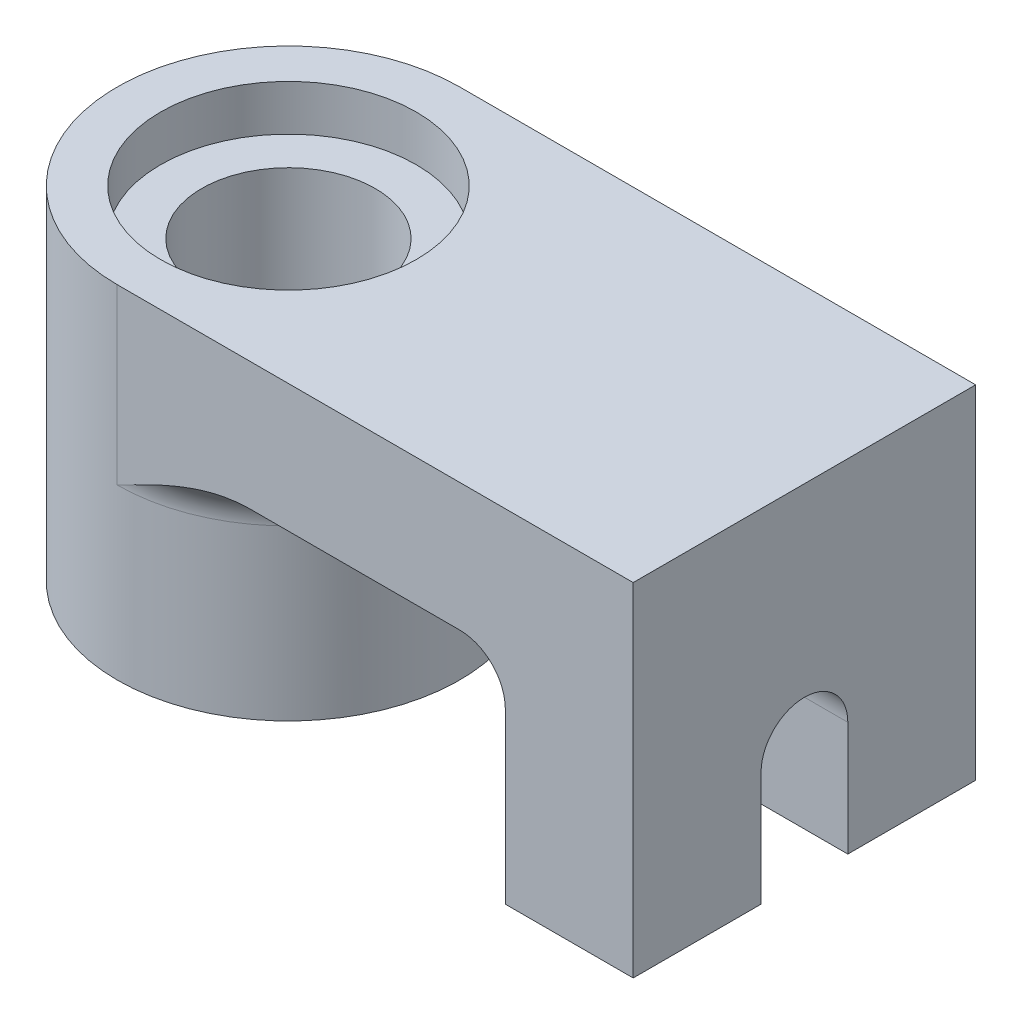
ISO-10303-21;
HEADER;
FILE_DESCRIPTION(('STEP AP214'),'2;1');
FILE_NAME('part.step','',(''),(''),'','','');
FILE_SCHEMA(('AUTOMOTIVE_DESIGN { 1 0 10303 214 1 1 1 1 }'));
ENDSEC;
DATA;
#1=APPLICATION_CONTEXT('core data for automotive mechanical design processes');
#2=APPLICATION_PROTOCOL_DEFINITION('international standard','automotive_design',2000,#1);
#3=PRODUCT_CONTEXT('',#1,'mechanical');
#4=PRODUCT('Part','Part','',(#3));
#5=PRODUCT_RELATED_PRODUCT_CATEGORY('part','',(#4));
#6=PRODUCT_DEFINITION_FORMATION('','',#4);
#7=PRODUCT_DEFINITION_CONTEXT('part definition',#1,'design');
#8=PRODUCT_DEFINITION('design','',#6,#7);
#9=PRODUCT_DEFINITION_SHAPE('','',#8);
#10=(LENGTH_UNIT() NAMED_UNIT(*) SI_UNIT(.MILLI.,.METRE.));
#11=(NAMED_UNIT(*) PLANE_ANGLE_UNIT() SI_UNIT($,.RADIAN.));
#12=(NAMED_UNIT(*) SI_UNIT($,.STERADIAN.) SOLID_ANGLE_UNIT());
#13=UNCERTAINTY_MEASURE_WITH_UNIT(LENGTH_MEASURE(1.E-05),#10,'distance_accuracy_value','');
#14=(GEOMETRIC_REPRESENTATION_CONTEXT(3) GLOBAL_UNCERTAINTY_ASSIGNED_CONTEXT((#13)) GLOBAL_UNIT_ASSIGNED_CONTEXT((#10,
#11,#12)) REPRESENTATION_CONTEXT('',''));
#15=CARTESIAN_POINT('',(0.,0.,0.));
#16=DIRECTION('',(0.,0.,1.));
#17=DIRECTION('',(1.,0.,0.));
#18=AXIS2_PLACEMENT_3D('',#15,#16,#17);
#19=CARTESIAN_POINT('',(0.,65.,0.));
#20=DIRECTION('',(0.,1.,0.));
#21=DIRECTION('',(0.,0.,1.));
#22=AXIS2_PLACEMENT_3D('',#19,#20,#21);
#23=PLANE('',#22);
#24=CARTESIAN_POINT('',(0.,65.,0.));
#25=DIRECTION('',(0.,1.,0.));
#26=DIRECTION('',(0.,0.,1.));
#27=AXIS2_PLACEMENT_3D('',#24,#25,#26);
#28=CIRCLE('',#27,28.);
#29=CARTESIAN_POINT('',(0.,65.,28.));
#30=VERTEX_POINT('',#29);
#31=EDGE_CURVE('E185',#30,#30,#28,.T.);
#32=ORIENTED_EDGE('',*,*,#31,.T.);
#33=EDGE_LOOP('',(#32));
#34=FACE_BOUND('',#33,.T.);
#35=DIRECTION('',(1.,0.,0.));
#36=VECTOR('',#35,1.);
#37=CARTESIAN_POINT('',(18.3303027798234,65.,-5.));
#38=LINE('',#37,#36);
#39=CARTESIAN_POINT('',(18.3303027798234,65.,-5.));
#40=VERTEX_POINT('',#39);
#41=CARTESIAN_POINT('',(22.,65.,-5.));
#42=VERTEX_POINT('',#41);
#43=EDGE_CURVE('E160',#40,#42,#38,.T.);
#44=ORIENTED_EDGE('',*,*,#43,.T.);
#45=DIRECTION('',(0.,0.,1.));
#46=VECTOR('',#45,1.);
#47=CARTESIAN_POINT('',(22.,65.,5.));
#48=LINE('',#47,#46);
#49=CARTESIAN_POINT('',(22.,65.,5.));
#50=VERTEX_POINT('',#49);
#51=EDGE_CURVE('E152',#42,#50,#48,.T.);
#52=ORIENTED_EDGE('',*,*,#51,.T.);
#53=DIRECTION('',(-1.,0.,0.));
#54=VECTOR('',#53,1.);
#55=CARTESIAN_POINT('',(18.3303027798234,65.,5.));
#56=LINE('',#55,#54);
#57=CARTESIAN_POINT('',(18.3303027798234,65.,5.));
#58=VERTEX_POINT('',#57);
#59=EDGE_CURVE('E163',#50,#58,#56,.T.);
#60=ORIENTED_EDGE('',*,*,#59,.T.);
#61=CARTESIAN_POINT('',(0.,65.,0.));
#62=DIRECTION('',(0.,-1.,0.));
#63=DIRECTION('',(0.,0.,-1.));
#64=AXIS2_PLACEMENT_3D('',#61,#62,#63);
#65=CIRCLE('',#64,19.);
#66=EDGE_CURVE('E57',#58,#40,#65,.T.);
#67=ORIENTED_EDGE('',*,*,#66,.T.);
#68=EDGE_LOOP('',(#44,#52,#60,#67));
#69=FACE_BOUND('',#68,.T.);
#70=ADVANCED_FACE('F37',(#34,#69),#23,.T.);
#71=CARTESIAN_POINT('',(85.,0.,0.));
#72=DIRECTION('',(0.,-1.,0.));
#73=DIRECTION('',(0.,0.,-1.));
#74=AXIS2_PLACEMENT_3D('',#71,#72,#73);
#75=PLANE('',#74);
#76=DIRECTION('',(1.,0.,0.));
#77=VECTOR('',#76,1.);
#78=CARTESIAN_POINT('',(85.,0.,9.5));
#79=LINE('',#78,#77);
#80=CARTESIAN_POINT('',(85.,0.,9.5));
#81=VERTEX_POINT('',#80);
#82=CARTESIAN_POINT('',(113.,0.,9.5));
#83=VERTEX_POINT('',#82);
#84=EDGE_CURVE('E207',#81,#83,#79,.T.);
#85=ORIENTED_EDGE('',*,*,#84,.T.);
#86=DIRECTION('',(0.,0.,-1.));
#87=VECTOR('',#86,1.);
#88=CARTESIAN_POINT('',(113.,0.,0.));
#89=LINE('',#88,#87);
#90=CARTESIAN_POINT('',(113.,0.,37.5));
#91=VERTEX_POINT('',#90);
#92=EDGE_CURVE('E226',#91,#83,#89,.T.);
#93=ORIENTED_EDGE('',*,*,#92,.F.);
#94=DIRECTION('',(1.,0.,0.));
#95=VECTOR('',#94,1.);
#96=CARTESIAN_POINT('',(85.,0.,37.5));
#97=LINE('',#96,#95);
#98=CARTESIAN_POINT('',(85.,0.,37.5));
#99=VERTEX_POINT('',#98);
#100=EDGE_CURVE('E232',#99,#91,#97,.T.);
#101=ORIENTED_EDGE('',*,*,#100,.F.);
#102=DIRECTION('',(0.,0.,-1.));
#103=VECTOR('',#102,1.);
#104=CARTESIAN_POINT('',(85.,0.,0.));
#105=LINE('',#104,#103);
#106=EDGE_CURVE('E229',#99,#81,#105,.T.);
#107=ORIENTED_EDGE('',*,*,#106,.T.);
#108=EDGE_LOOP('',(#85,#93,#101,#107));
#109=FACE_BOUND('',#108,.T.);
#110=ADVANCED_FACE('F321',(#109),#75,.T.);
#111=CARTESIAN_POINT('',(0.,47.,0.));
#112=DIRECTION('',(0.,1.,0.));
#113=DIRECTION('',(0.,0.,1.));
#114=AXIS2_PLACEMENT_3D('',#111,#112,#113);
#115=PLANE('',#114);
#116=DIRECTION('',(1.,0.,0.));
#117=VECTOR('',#116,1.);
#118=CARTESIAN_POINT('',(113.,47.,37.5));
#119=LINE('',#118,#117);
#120=CARTESIAN_POINT('',(29.1547594742265,47.,37.5));
#121=VERTEX_POINT('',#120);
#122=CARTESIAN_POINT('',(75.,47.,37.5));
#123=VERTEX_POINT('',#122);
#124=EDGE_CURVE('E241',#121,#123,#119,.T.);
#125=ORIENTED_EDGE('',*,*,#124,.F.);
#126=CARTESIAN_POINT('',(0.,47.,0.));
#127=DIRECTION('',(0.,1.,0.));
#128=DIRECTION('',(0.,0.,1.));
#129=AXIS2_PLACEMENT_3D('',#126,#127,#128);
#130=CIRCLE('',#129,47.5);
#131=CARTESIAN_POINT('',(29.1547594742265,47.,-37.5));
#132=VERTEX_POINT('',#131);
#133=EDGE_CURVE('E275',#121,#132,#130,.T.);
#134=ORIENTED_EDGE('',*,*,#133,.T.);
#135=DIRECTION('',(-1.,0.,0.));
#136=VECTOR('',#135,1.);
#137=CARTESIAN_POINT('',(0.,47.,-37.5));
#138=LINE('',#137,#136);
#139=CARTESIAN_POINT('',(75.,47.,-37.5));
#140=VERTEX_POINT('',#139);
#141=EDGE_CURVE('E244',#140,#132,#138,.T.);
#142=ORIENTED_EDGE('',*,*,#141,.F.);
#143=DIRECTION('',(0.,0.,-1.));
#144=VECTOR('',#143,1.);
#145=CARTESIAN_POINT('',(75.,47.,37.5));
#146=LINE('',#145,#144);
#147=EDGE_CURVE('E273',#140,#123,#146,.F.);
#148=ORIENTED_EDGE('',*,*,#147,.T.);
#149=EDGE_LOOP('',(#125,#134,#142,#148));
#150=FACE_BOUND('',#149,.T.);
#151=ADVANCED_FACE('F308',(#150),#115,.F.);
#152=CARTESIAN_POINT('',(0.,75.,0.));
#153=DIRECTION('',(0.,-1.,0.));
#154=DIRECTION('',(0.,0.,-1.));
#155=AXIS2_PLACEMENT_3D('',#152,#153,#154);
#156=CYLINDRICAL_SURFACE('',#155,37.5);
#157=CARTESIAN_POINT('',(0.,37.,0.));
#158=DIRECTION('',(0.,1.,0.));
#159=DIRECTION('',(0.,0.,1.));
#160=AXIS2_PLACEMENT_3D('',#157,#158,#159);
#161=CIRCLE('',#160,37.5);
#162=CARTESIAN_POINT('',(0.,37.,-37.5));
#163=VERTEX_POINT('',#162);
#164=CARTESIAN_POINT('',(0.,37.,37.5));
#165=VERTEX_POINT('',#164);
#166=EDGE_CURVE('E268',#163,#165,#161,.F.);
#167=ORIENTED_EDGE('',*,*,#166,.T.);
#168=DIRECTION('',(0.,1.,0.));
#169=VECTOR('',#168,1.);
#170=CARTESIAN_POINT('',(0.,47.,37.5));
#171=LINE('',#170,#169);
#172=CARTESIAN_POINT('',(0.,75.,37.5));
#173=VERTEX_POINT('',#172);
#174=EDGE_CURVE('E248',#165,#173,#171,.T.);
#175=ORIENTED_EDGE('',*,*,#174,.T.);
#176=CARTESIAN_POINT('',(0.,75.,0.));
#177=DIRECTION('',(0.,1.,0.));
#178=DIRECTION('',(0.,0.,1.));
#179=AXIS2_PLACEMENT_3D('',#176,#177,#178);
#180=CIRCLE('',#179,37.5);
#181=CARTESIAN_POINT('',(0.,75.,-37.5));
#182=VERTEX_POINT('',#181);
#183=EDGE_CURVE('E265',#182,#173,#180,.T.);
#184=ORIENTED_EDGE('',*,*,#183,.F.);
#185=DIRECTION('',(0.,1.,0.));
#186=VECTOR('',#185,1.);
#187=CARTESIAN_POINT('',(0.,47.,-37.5));
#188=LINE('',#187,#186);
#189=EDGE_CURVE('E255',#163,#182,#188,.T.);
#190=ORIENTED_EDGE('',*,*,#189,.F.);
#191=EDGE_LOOP('',(#167,#175,#184,#190));
#192=FACE_BOUND('',#191,.T.);
#193=CARTESIAN_POINT('',(0.,0.,0.));
#194=DIRECTION('',(0.,1.,0.));
#195=DIRECTION('',(0.,0.,1.));
#196=AXIS2_PLACEMENT_3D('',#193,#194,#195);
#197=CIRCLE('',#196,37.5);
#198=CARTESIAN_POINT('',(0.,0.,37.5));
#199=VERTEX_POINT('',#198);
#200=EDGE_CURVE('E258',#199,#199,#197,.T.);
#201=ORIENTED_EDGE('',*,*,#200,.T.);
#202=EDGE_LOOP('',(#201));
#203=FACE_BOUND('',#202,.T.);
#204=ADVANCED_FACE('F303',(#192,#203),#156,.T.);
#205=CARTESIAN_POINT('',(0.,75.,0.));
#206=DIRECTION('',(0.,1.,0.));
#207=DIRECTION('',(0.,0.,1.));
#208=AXIS2_PLACEMENT_3D('',#205,#206,#207);
#209=PLANE('',#208);
#210=CARTESIAN_POINT('',(0.,75.,0.));
#211=DIRECTION('',(0.,1.,0.));
#212=DIRECTION('',(0.,0.,1.));
#213=AXIS2_PLACEMENT_3D('',#210,#211,#212);
#214=CIRCLE('',#213,28.);
#215=CARTESIAN_POINT('',(0.,75.,28.));
#216=VERTEX_POINT('',#215);
#217=EDGE_CURVE('E181',#216,#216,#214,.T.);
#218=ORIENTED_EDGE('',*,*,#217,.F.);
#219=EDGE_LOOP('',(#218));
#220=FACE_BOUND('',#219,.T.);
#221=ORIENTED_EDGE('',*,*,#183,.T.);
#222=DIRECTION('',(1.,0.,0.));
#223=VECTOR('',#222,1.);
#224=CARTESIAN_POINT('',(113.,75.,37.5));
#225=LINE('',#224,#223);
#226=CARTESIAN_POINT('',(113.,75.,37.5));
#227=VERTEX_POINT('',#226);
#228=EDGE_CURVE('E238',#173,#227,#225,.T.);
#229=ORIENTED_EDGE('',*,*,#228,.T.);
#230=DIRECTION('',(0.,0.,-1.));
#231=VECTOR('',#230,1.);
#232=CARTESIAN_POINT('',(113.,75.,-37.5));
#233=LINE('',#232,#231);
#234=CARTESIAN_POINT('',(113.,75.,-37.5));
#235=VERTEX_POINT('',#234);
#236=EDGE_CURVE('E251',#227,#235,#233,.T.);
#237=ORIENTED_EDGE('',*,*,#236,.T.);
#238=DIRECTION('',(-1.,0.,0.));
#239=VECTOR('',#238,1.);
#240=CARTESIAN_POINT('',(0.,75.,-37.5));
#241=LINE('',#240,#239);
#242=EDGE_CURVE('E245',#235,#182,#241,.T.);
#243=ORIENTED_EDGE('',*,*,#242,.T.);
#244=EDGE_LOOP('',(#221,#229,#237,#243));
#245=FACE_BOUND('',#244,.T.);
#246=ADVANCED_FACE('F307',(#220,#245),#209,.T.);
#247=CARTESIAN_POINT('',(0.,0.,0.));
#248=DIRECTION('',(0.,1.,0.));
#249=DIRECTION('',(0.,0.,1.));
#250=AXIS2_PLACEMENT_3D('',#247,#248,#249);
#251=PLANE('',#250);
#252=CARTESIAN_POINT('',(0.,0.,0.));
#253=DIRECTION('',(0.,-1.,0.));
#254=DIRECTION('',(0.,0.,-1.));
#255=AXIS2_PLACEMENT_3D('',#252,#253,#254);
#256=CIRCLE('',#255,28.);
#257=CARTESIAN_POINT('',(0.,0.,-28.));
#258=VERTEX_POINT('',#257);
#259=EDGE_CURVE('E188',#258,#258,#256,.T.);
#260=ORIENTED_EDGE('',*,*,#259,.F.);
#261=EDGE_LOOP('',(#260));
#262=FACE_BOUND('',#261,.T.);
#263=ORIENTED_EDGE('',*,*,#200,.F.);
#264=EDGE_LOOP('',(#263));
#265=FACE_BOUND('',#264,.T.);
#266=ADVANCED_FACE('F310',(#262,#265),#251,.F.);
#267=CARTESIAN_POINT('',(0.,47.,-37.5));
#268=DIRECTION('',(0.,0.,-1.));
#269=DIRECTION('',(-1.,0.,0.));
#270=AXIS2_PLACEMENT_3D('',#267,#268,#269);
#271=PLANE('',#270);
#272=ORIENTED_EDGE('',*,*,#242,.F.);
#273=DIRECTION('',(0.,1.,0.));
#274=VECTOR('',#273,1.);
#275=CARTESIAN_POINT('',(113.,47.,-37.5));
#276=LINE('',#275,#274);
#277=CARTESIAN_POINT('',(113.,0.,-37.5));
#278=VERTEX_POINT('',#277);
#279=EDGE_CURVE('E259',#278,#235,#276,.T.);
#280=ORIENTED_EDGE('',*,*,#279,.F.);
#281=DIRECTION('',(1.,0.,0.));
#282=VECTOR('',#281,1.);
#283=CARTESIAN_POINT('',(85.,0.,-37.5));
#284=LINE('',#283,#282);
#285=CARTESIAN_POINT('',(85.,0.,-37.5));
#286=VERTEX_POINT('',#285);
#287=EDGE_CURVE('E235',#286,#278,#284,.T.);
#288=ORIENTED_EDGE('',*,*,#287,.F.);
#289=DIRECTION('',(0.,-1.,0.));
#290=VECTOR('',#289,1.);
#291=CARTESIAN_POINT('',(85.,0.,-37.5));
#292=LINE('',#291,#290);
#293=CARTESIAN_POINT('',(85.,37.,-37.5));
#294=VERTEX_POINT('',#293);
#295=EDGE_CURVE('E223',#294,#286,#292,.T.);
#296=ORIENTED_EDGE('',*,*,#295,.F.);
#297=CARTESIAN_POINT('',(75.,37.,-37.5));
#298=DIRECTION('',(0.,0.,-1.));
#299=DIRECTION('',(-1.,0.,0.));
#300=AXIS2_PLACEMENT_3D('',#297,#298,#299);
#301=CIRCLE('',#300,10.);
#302=EDGE_CURVE('E45',#294,#140,#301,.F.);
#303=ORIENTED_EDGE('',*,*,#302,.T.);
#304=ORIENTED_EDGE('',*,*,#141,.T.);
#305=CARTESIAN_POINT('',(29.1547594742265,47.,-37.5));
#306=CARTESIAN_POINT('',(28.7281693213228,46.9999786648102,-37.5));
#307=CARTESIAN_POINT('',(28.3016560019996,46.9897176285424,-37.5));
#308=CARTESIAN_POINT('',(27.4496484749261,46.9502563822744,-37.5));
#309=CARTESIAN_POINT('',(27.024153956718,46.9210629612355,-37.5));
#310=CARTESIAN_POINT('',(26.1755938350662,46.8453509022313,-37.5));
#311=CARTESIAN_POINT('',(25.7525250727972,46.7988671030009,-37.5));
#312=CARTESIAN_POINT('',(24.9084309647712,46.6899429264348,-37.5));
#313=CARTESIAN_POINT('',(24.4874058253184,46.627500970907,-37.5));
#314=CARTESIAN_POINT('',(23.2383730962655,46.419910698324,-37.5));
#315=CARTESIAN_POINT('',(22.4138500474263,46.2534877898218,-37.5));
#316=CARTESIAN_POINT('',(20.7758132686213,45.8722744341559,-37.5));
#317=CARTESIAN_POINT('',(19.9623061865924,45.6574560495466,-37.5));
#318=CARTESIAN_POINT('',(18.3204624353035,45.1793915225373,-37.5));
#319=CARTESIAN_POINT('',(17.4925271858538,44.9147769090196,-37.5));
#320=CARTESIAN_POINT('',(15.8489631392522,44.349540468796,-37.5));
#321=CARTESIAN_POINT('',(15.0333369587783,44.0489111041277,-37.5));
#322=CARTESIAN_POINT('',(13.4132111825291,43.4180675261109,-37.5));
#323=CARTESIAN_POINT('',(12.6087174048075,43.0878384708328,-37.5));
#324=CARTESIAN_POINT('',(11.0098130339382,42.4037240648882,-37.5));
#325=CARTESIAN_POINT('',(10.2154035091204,42.0498362322809,-37.5));
#326=CARTESIAN_POINT('',(7.83689487856671,40.9571068783275,-37.5));
#327=CARTESIAN_POINT('',(6.26563680593886,40.1904834914459,-37.5));
#328=CARTESIAN_POINT('',(3.14103857075623,38.6218750777498,-37.5));
#329=CARTESIAN_POINT('',(1.58770134812253,37.8198843501225,-37.5));
#330=CARTESIAN_POINT('',(0.0229415743856792,37.0118469772453,-37.5));
#331=CARTESIAN_POINT('',(0.011470787697866,37.0059234884571,-37.5));
#332=CARTESIAN_POINT('',(0.,37.,-37.5));
#333=B_SPLINE_CURVE_WITH_KNOTS('',3,(#305,#306,#307,#308,#309,#310,#311,#312,#313,#314,#315,
#316,#317,#318,#319,#320,#321,#322,#323,#324,#325,#326,#327,#328,#329,#330,#331,#332),
.UNSPECIFIED.,.F.,.F.,(4,2,2,2,2,2,2,2,2,2,2,2,2,4),(0.,1.27953571376794,2.55861285251057,
3.83512659167913,5.11176662137853,7.63330150528421,10.156295752437,12.7628652516213,
15.3699812675309,17.9784119403917,20.587116683209,25.8307743780356,31.0752804024461,
31.1140102359086),.UNSPECIFIED.);
#334=EDGE_CURVE('E287',#132,#163,#333,.T.);
#335=ORIENTED_EDGE('',*,*,#334,.T.);
#336=ORIENTED_EDGE('',*,*,#189,.T.);
#337=EDGE_LOOP('',(#272,#280,#288,#296,#303,#304,#335,#336));
#338=FACE_BOUND('',#337,.T.);
#339=ADVANCED_FACE('F312',(#338),#271,.T.);
#340=CARTESIAN_POINT('',(113.,47.,-37.5));
#341=DIRECTION('',(1.,0.,0.));
#342=DIRECTION('',(0.,0.,-1.));
#343=AXIS2_PLACEMENT_3D('',#340,#341,#342);
#344=PLANE('',#343);
#345=DIRECTION('',(0.,-1.,0.));
#346=VECTOR('',#345,1.);
#347=CARTESIAN_POINT('',(113.,0.,9.5));
#348=LINE('',#347,#346);
#349=CARTESIAN_POINT('',(113.,25.,9.5));
#350=VERTEX_POINT('',#349);
#351=EDGE_CURVE('E194',#350,#83,#348,.T.);
#352=ORIENTED_EDGE('',*,*,#351,.F.);
#353=CARTESIAN_POINT('',(113.,25.,0.));
#354=DIRECTION('',(1.,0.,0.));
#355=DIRECTION('',(0.,0.,1.));
#356=AXIS2_PLACEMENT_3D('',#353,#354,#355);
#357=CIRCLE('',#356,9.5);
#358=CARTESIAN_POINT('',(113.,25.,-9.5));
#359=VERTEX_POINT('',#358);
#360=EDGE_CURVE('E201',#359,#350,#357,.T.);
#361=ORIENTED_EDGE('',*,*,#360,.F.);
#362=DIRECTION('',(0.,1.,0.));
#363=VECTOR('',#362,1.);
#364=CARTESIAN_POINT('',(113.,0.,-9.5));
#365=LINE('',#364,#363);
#366=CARTESIAN_POINT('',(113.,0.,-9.5));
#367=VERTEX_POINT('',#366);
#368=EDGE_CURVE('E209',#367,#359,#365,.T.);
#369=ORIENTED_EDGE('',*,*,#368,.F.);
#370=EDGE_CURVE('E216',#367,#278,#89,.T.);
#371=ORIENTED_EDGE('',*,*,#370,.T.);
#372=ORIENTED_EDGE('',*,*,#279,.T.);
#373=ORIENTED_EDGE('',*,*,#236,.F.);
#374=DIRECTION('',(0.,1.,0.));
#375=VECTOR('',#374,1.);
#376=CARTESIAN_POINT('',(113.,47.,37.5));
#377=LINE('',#376,#375);
#378=EDGE_CURVE('E261',#91,#227,#377,.T.);
#379=ORIENTED_EDGE('',*,*,#378,.F.);
#380=ORIENTED_EDGE('',*,*,#92,.T.);
#381=EDGE_LOOP('',(#352,#361,#369,#371,#372,#373,#379,#380));
#382=FACE_BOUND('',#381,.T.);
#383=ADVANCED_FACE('F366',(#382),#344,.T.);
#384=CARTESIAN_POINT('',(113.,47.,37.5));
#385=DIRECTION('',(0.,0.,1.));
#386=DIRECTION('',(1.,0.,0.));
#387=AXIS2_PLACEMENT_3D('',#384,#385,#386);
#388=PLANE('',#387);
#389=ORIENTED_EDGE('',*,*,#228,.F.);
#390=ORIENTED_EDGE('',*,*,#174,.F.);
#391=CARTESIAN_POINT('',(29.1547594742265,47.,37.5));
#392=CARTESIAN_POINT('',(28.7281693213228,46.9999786648102,37.5));
#393=CARTESIAN_POINT('',(28.3016560019996,46.9897176285424,37.5));
#394=CARTESIAN_POINT('',(27.4496484749261,46.9502563822744,37.5));
#395=CARTESIAN_POINT('',(27.024153956718,46.9210629612355,37.5));
#396=CARTESIAN_POINT('',(26.1755938350662,46.8453509022313,37.5));
#397=CARTESIAN_POINT('',(25.7525250727972,46.7988671030009,37.5));
#398=CARTESIAN_POINT('',(24.9084309647712,46.6899429264348,37.5));
#399=CARTESIAN_POINT('',(24.4874058253184,46.627500970907,37.5));
#400=CARTESIAN_POINT('',(23.2383730962655,46.419910698324,37.5));
#401=CARTESIAN_POINT('',(22.4138500474263,46.2534877898218,37.5));
#402=CARTESIAN_POINT('',(20.7758132686213,45.8722744341559,37.5));
#403=CARTESIAN_POINT('',(19.9623061865924,45.6574560495466,37.5));
#404=CARTESIAN_POINT('',(18.3204624353035,45.1793915225373,37.5));
#405=CARTESIAN_POINT('',(17.4925271858538,44.9147769090196,37.5));
#406=CARTESIAN_POINT('',(15.8489631392522,44.349540468796,37.5));
#407=CARTESIAN_POINT('',(15.0333369587783,44.0489111041277,37.5));
#408=CARTESIAN_POINT('',(13.4132111825291,43.4180675261109,37.5));
#409=CARTESIAN_POINT('',(12.6087174048075,43.0878384708328,37.5));
#410=CARTESIAN_POINT('',(11.0098130339382,42.4037240648882,37.5));
#411=CARTESIAN_POINT('',(10.2154035091204,42.0498362322809,37.5));
#412=CARTESIAN_POINT('',(7.83689487856671,40.9571068783275,37.5));
#413=CARTESIAN_POINT('',(6.26563680593886,40.1904834914459,37.5));
#414=CARTESIAN_POINT('',(3.14103857075623,38.6218750777498,37.5));
#415=CARTESIAN_POINT('',(1.58770134812253,37.8198843501225,37.5));
#416=CARTESIAN_POINT('',(0.0229415743856792,37.0118469772453,37.5));
#417=CARTESIAN_POINT('',(0.011470787697866,37.0059234884571,37.5));
#418=CARTESIAN_POINT('',(0.,37.,37.5));
#419=B_SPLINE_CURVE_WITH_KNOTS('',3,(#391,#392,#393,#394,#395,#396,#397,#398,#399,#400,#401,
#402,#403,#404,#405,#406,#407,#408,#409,#410,#411,#412,#413,#414,#415,#416,#417,#418),
.UNSPECIFIED.,.F.,.F.,(4,2,2,2,2,2,2,2,2,2,2,2,2,4),(0.,1.27953571376794,2.55861285251057,
3.83512659167913,5.11176662137853,7.63330150528421,10.156295752437,12.7628652516213,
15.3699812675309,17.9784119403917,20.587116683209,25.8307743780356,31.0752804024461,
31.1140102359086),.UNSPECIFIED.);
#420=EDGE_CURVE('E280',#165,#121,#419,.F.);
#421=ORIENTED_EDGE('',*,*,#420,.T.);
#422=ORIENTED_EDGE('',*,*,#124,.T.);
#423=CARTESIAN_POINT('',(75.,37.,37.5));
#424=DIRECTION('',(0.,0.,1.));
#425=DIRECTION('',(1.,0.,0.));
#426=AXIS2_PLACEMENT_3D('',#423,#424,#425);
#427=CIRCLE('',#426,10.);
#428=CARTESIAN_POINT('',(85.,37.,37.5));
#429=VERTEX_POINT('',#428);
#430=EDGE_CURVE('E11',#123,#429,#427,.F.);
#431=ORIENTED_EDGE('',*,*,#430,.T.);
#432=DIRECTION('',(0.,-1.,0.));
#433=VECTOR('',#432,1.);
#434=CARTESIAN_POINT('',(85.,0.,37.5));
#435=LINE('',#434,#433);
#436=EDGE_CURVE('E225',#429,#99,#435,.T.);
#437=ORIENTED_EDGE('',*,*,#436,.T.);
#438=ORIENTED_EDGE('',*,*,#100,.T.);
#439=ORIENTED_EDGE('',*,*,#378,.T.);
#440=EDGE_LOOP('',(#389,#390,#421,#422,#431,#437,#438,#439));
#441=FACE_BOUND('',#440,.T.);
#442=ADVANCED_FACE('F293',(#441),#388,.T.);
#443=DIRECTION('',(1.,0.,0.));
#444=VECTOR('',#443,1.);
#445=CARTESIAN_POINT('',(85.,0.,-9.5));
#446=LINE('',#445,#444);
#447=CARTESIAN_POINT('',(85.,0.,-9.5));
#448=VERTEX_POINT('',#447);
#449=EDGE_CURVE('E219',#448,#367,#446,.T.);
#450=ORIENTED_EDGE('',*,*,#449,.F.);
#451=EDGE_CURVE('E228',#448,#286,#105,.T.);
#452=ORIENTED_EDGE('',*,*,#451,.T.);
#453=ORIENTED_EDGE('',*,*,#287,.T.);
#454=ORIENTED_EDGE('',*,*,#370,.F.);
#455=EDGE_LOOP('',(#450,#452,#453,#454));
#456=FACE_BOUND('',#455,.T.);
#457=ADVANCED_FACE('F329',(#456),#75,.T.);
#458=CARTESIAN_POINT('',(85.,0.,0.));
#459=DIRECTION('',(1.,0.,0.));
#460=DIRECTION('',(0.,0.,-1.));
#461=AXIS2_PLACEMENT_3D('',#458,#459,#460);
#462=PLANE('',#461);
#463=ORIENTED_EDGE('',*,*,#436,.F.);
#464=DIRECTION('',(0.,0.,-1.));
#465=VECTOR('',#464,1.);
#466=CARTESIAN_POINT('',(85.,37.,-37.5));
#467=LINE('',#466,#465);
#468=EDGE_CURVE('E277',#429,#294,#467,.T.);
#469=ORIENTED_EDGE('',*,*,#468,.T.);
#470=ORIENTED_EDGE('',*,*,#295,.T.);
#471=ORIENTED_EDGE('',*,*,#451,.F.);
#472=DIRECTION('',(0.,1.,0.));
#473=VECTOR('',#472,1.);
#474=CARTESIAN_POINT('',(85.,0.,-9.5));
#475=LINE('',#474,#473);
#476=CARTESIAN_POINT('',(85.,25.,-9.5));
#477=VERTEX_POINT('',#476);
#478=EDGE_CURVE('E200',#448,#477,#475,.T.);
#479=ORIENTED_EDGE('',*,*,#478,.T.);
#480=CARTESIAN_POINT('',(85.,25.,0.));
#481=DIRECTION('',(1.,0.,0.));
#482=DIRECTION('',(0.,0.,1.));
#483=AXIS2_PLACEMENT_3D('',#480,#481,#482);
#484=CIRCLE('',#483,9.5);
#485=CARTESIAN_POINT('',(85.,25.,9.5));
#486=VERTEX_POINT('',#485);
#487=EDGE_CURVE('E204',#477,#486,#484,.T.);
#488=ORIENTED_EDGE('',*,*,#487,.T.);
#489=DIRECTION('',(0.,-1.,0.));
#490=VECTOR('',#489,1.);
#491=CARTESIAN_POINT('',(85.,0.,9.5));
#492=LINE('',#491,#490);
#493=EDGE_CURVE('E197',#486,#81,#492,.T.);
#494=ORIENTED_EDGE('',*,*,#493,.T.);
#495=ORIENTED_EDGE('',*,*,#106,.F.);
#496=EDGE_LOOP('',(#463,#469,#470,#471,#479,#488,#494,#495));
#497=FACE_BOUND('',#496,.T.);
#498=ADVANCED_FACE('F355',(#497),#462,.F.);
#499=CARTESIAN_POINT('',(85.,0.,9.5));
#500=DIRECTION('',(0.,0.,1.));
#501=DIRECTION('',(0.,-1.,0.));
#502=AXIS2_PLACEMENT_3D('',#499,#500,#501);
#503=PLANE('',#502);
#504=ORIENTED_EDGE('',*,*,#351,.T.);
#505=ORIENTED_EDGE('',*,*,#84,.F.);
#506=ORIENTED_EDGE('',*,*,#493,.F.);
#507=DIRECTION('',(1.,0.,0.));
#508=VECTOR('',#507,1.);
#509=CARTESIAN_POINT('',(85.,25.,9.5));
#510=LINE('',#509,#508);
#511=EDGE_CURVE('E214',#486,#350,#510,.T.);
#512=ORIENTED_EDGE('',*,*,#511,.T.);
#513=EDGE_LOOP('',(#504,#505,#506,#512));
#514=FACE_BOUND('',#513,.T.);
#515=ADVANCED_FACE('F348',(#514),#503,.F.);
#516=CARTESIAN_POINT('',(85.,25.,0.));
#517=DIRECTION('',(1.,0.,0.));
#518=DIRECTION('',(0.,0.,-1.));
#519=AXIS2_PLACEMENT_3D('',#516,#517,#518);
#520=CYLINDRICAL_SURFACE('',#519,9.5);
#521=ORIENTED_EDGE('',*,*,#360,.T.);
#522=ORIENTED_EDGE('',*,*,#511,.F.);
#523=ORIENTED_EDGE('',*,*,#487,.F.);
#524=DIRECTION('',(1.,0.,0.));
#525=VECTOR('',#524,1.);
#526=CARTESIAN_POINT('',(85.,25.,-9.5));
#527=LINE('',#526,#525);
#528=EDGE_CURVE('E217',#477,#359,#527,.T.);
#529=ORIENTED_EDGE('',*,*,#528,.T.);
#530=EDGE_LOOP('',(#521,#522,#523,#529));
#531=FACE_BOUND('',#530,.T.);
#532=ADVANCED_FACE('F345',(#531),#520,.F.);
#533=CARTESIAN_POINT('',(85.,0.,-9.5));
#534=DIRECTION('',(0.,0.,-1.));
#535=DIRECTION('',(0.,1.,0.));
#536=AXIS2_PLACEMENT_3D('',#533,#534,#535);
#537=PLANE('',#536);
#538=ORIENTED_EDGE('',*,*,#368,.T.);
#539=ORIENTED_EDGE('',*,*,#528,.F.);
#540=ORIENTED_EDGE('',*,*,#478,.F.);
#541=ORIENTED_EDGE('',*,*,#449,.T.);
#542=EDGE_LOOP('',(#538,#539,#540,#541));
#543=FACE_BOUND('',#542,.T.);
#544=ADVANCED_FACE('F301',(#543),#537,.F.);
#545=CARTESIAN_POINT('',(0.,37.,0.));
#546=DIRECTION('',(0.,1.,0.));
#547=DIRECTION('',(0.,0.,1.));
#548=AXIS2_PLACEMENT_3D('',#545,#546,#547);
#549=TOROIDAL_SURFACE('',#548,47.5,10.);
#550=ORIENTED_EDGE('',*,*,#334,.F.);
#551=ORIENTED_EDGE('',*,*,#133,.F.);
#552=ORIENTED_EDGE('',*,*,#420,.F.);
#553=ORIENTED_EDGE('',*,*,#166,.F.);
#554=EDGE_LOOP('',(#550,#551,#552,#553));
#555=FACE_BOUND('',#554,.T.);
#556=ADVANCED_FACE('F297',(#555),#549,.F.);
#557=CARTESIAN_POINT('',(75.,37.,0.));
#558=DIRECTION('',(0.,0.,1.));
#559=DIRECTION('',(1.,0.,0.));
#560=AXIS2_PLACEMENT_3D('',#557,#558,#559);
#561=CYLINDRICAL_SURFACE('',#560,10.);
#562=ORIENTED_EDGE('',*,*,#430,.F.);
#563=ORIENTED_EDGE('',*,*,#147,.F.);
#564=ORIENTED_EDGE('',*,*,#302,.F.);
#565=ORIENTED_EDGE('',*,*,#468,.F.);
#566=EDGE_LOOP('',(#562,#563,#564,#565));
#567=FACE_BOUND('',#566,.T.);
#568=ADVANCED_FACE('F39',(#567),#561,.F.);
#569=CARTESIAN_POINT('',(0.,10.,0.));
#570=DIRECTION('',(0.,-1.,0.));
#571=DIRECTION('',(0.,0.,-1.));
#572=AXIS2_PLACEMENT_3D('',#569,#570,#571);
#573=CYLINDRICAL_SURFACE('',#572,28.);
#574=CARTESIAN_POINT('',(0.,10.,0.));
#575=DIRECTION('',(0.,-1.,0.));
#576=DIRECTION('',(0.,0.,-1.));
#577=AXIS2_PLACEMENT_3D('',#574,#575,#576);
#578=CIRCLE('',#577,28.);
#579=CARTESIAN_POINT('',(0.,10.,-28.));
#580=VERTEX_POINT('',#579);
#581=EDGE_CURVE('E191',#580,#580,#578,.T.);
#582=ORIENTED_EDGE('',*,*,#581,.F.);
#583=EDGE_LOOP('',(#582));
#584=FACE_BOUND('',#583,.T.);
#585=ORIENTED_EDGE('',*,*,#259,.T.);
#586=EDGE_LOOP('',(#585));
#587=FACE_BOUND('',#586,.T.);
#588=ADVANCED_FACE('F340',(#584,#587),#573,.F.);
#589=CARTESIAN_POINT('',(0.,10.,0.));
#590=DIRECTION('',(0.,-1.,0.));
#591=DIRECTION('',(0.,0.,-1.));
#592=AXIS2_PLACEMENT_3D('',#589,#590,#591);
#593=PLANE('',#592);
#594=DIRECTION('',(0.,0.,1.));
#595=VECTOR('',#594,1.);
#596=CARTESIAN_POINT('',(22.,10.,5.));
#597=LINE('',#596,#595);
#598=CARTESIAN_POINT('',(22.,10.,-5.));
#599=VERTEX_POINT('',#598);
#600=CARTESIAN_POINT('',(22.,10.,5.));
#601=VERTEX_POINT('',#600);
#602=EDGE_CURVE('E155',#599,#601,#597,.T.);
#603=ORIENTED_EDGE('',*,*,#602,.F.);
#604=DIRECTION('',(1.,0.,0.));
#605=VECTOR('',#604,1.);
#606=CARTESIAN_POINT('',(18.3303027798234,10.,-5.));
#607=LINE('',#606,#605);
#608=CARTESIAN_POINT('',(18.3303027798234,10.,-5.));
#609=VERTEX_POINT('',#608);
#610=EDGE_CURVE('E168',#609,#599,#607,.T.);
#611=ORIENTED_EDGE('',*,*,#610,.F.);
#612=CARTESIAN_POINT('',(0.,10.,0.));
#613=DIRECTION('',(0.,-1.,0.));
#614=DIRECTION('',(0.,0.,-1.));
#615=AXIS2_PLACEMENT_3D('',#612,#613,#614);
#616=CIRCLE('',#615,19.);
#617=CARTESIAN_POINT('',(18.3303027798234,10.,5.));
#618=VERTEX_POINT('',#617);
#619=EDGE_CURVE('E52',#618,#609,#616,.T.);
#620=ORIENTED_EDGE('',*,*,#619,.F.);
#621=DIRECTION('',(-1.,0.,0.));
#622=VECTOR('',#621,1.);
#623=CARTESIAN_POINT('',(18.3303027798234,10.,5.));
#624=LINE('',#623,#622);
#625=EDGE_CURVE('E176',#601,#618,#624,.T.);
#626=ORIENTED_EDGE('',*,*,#625,.F.);
#627=EDGE_LOOP('',(#603,#611,#620,#626));
#628=FACE_BOUND('',#627,.T.);
#629=ORIENTED_EDGE('',*,*,#581,.T.);
#630=EDGE_LOOP('',(#629));
#631=FACE_BOUND('',#630,.T.);
#632=ADVANCED_FACE('F336',(#628,#631),#593,.T.);
#633=CARTESIAN_POINT('',(0.,65.,0.));
#634=DIRECTION('',(0.,1.,0.));
#635=DIRECTION('',(0.,0.,1.));
#636=AXIS2_PLACEMENT_3D('',#633,#634,#635);
#637=CYLINDRICAL_SURFACE('',#636,28.);
#638=ORIENTED_EDGE('',*,*,#31,.F.);
#639=EDGE_LOOP('',(#638));
#640=FACE_BOUND('',#639,.T.);
#641=ORIENTED_EDGE('',*,*,#217,.T.);
#642=EDGE_LOOP('',(#641));
#643=FACE_BOUND('',#642,.T.);
#644=ADVANCED_FACE('F333',(#640,#643),#637,.F.);
#645=CARTESIAN_POINT('',(22.,65.,5.));
#646=DIRECTION('',(1.,0.,0.));
#647=DIRECTION('',(0.,0.,-1.));
#648=AXIS2_PLACEMENT_3D('',#645,#646,#647);
#649=PLANE('',#648);
#650=ORIENTED_EDGE('',*,*,#602,.T.);
#651=DIRECTION('',(0.,-1.,0.));
#652=VECTOR('',#651,1.);
#653=CARTESIAN_POINT('',(22.,65.,5.));
#654=LINE('',#653,#652);
#655=EDGE_CURVE('E148',#50,#601,#654,.T.);
#656=ORIENTED_EDGE('',*,*,#655,.F.);
#657=ORIENTED_EDGE('',*,*,#51,.F.);
#658=DIRECTION('',(0.,-1.,0.));
#659=VECTOR('',#658,1.);
#660=CARTESIAN_POINT('',(22.,65.,-5.));
#661=LINE('',#660,#659);
#662=EDGE_CURVE('E179',#42,#599,#661,.T.);
#663=ORIENTED_EDGE('',*,*,#662,.T.);
#664=EDGE_LOOP('',(#650,#656,#657,#663));
#665=FACE_BOUND('',#664,.T.);
#666=ADVANCED_FACE('F150',(#665),#649,.F.);
#667=CARTESIAN_POINT('',(18.3303027798234,65.,-5.));
#668=DIRECTION('',(0.,0.,-1.));
#669=DIRECTION('',(-1.,0.,0.));
#670=AXIS2_PLACEMENT_3D('',#667,#668,#669);
#671=PLANE('',#670);
#672=ORIENTED_EDGE('',*,*,#610,.T.);
#673=ORIENTED_EDGE('',*,*,#662,.F.);
#674=ORIENTED_EDGE('',*,*,#43,.F.);
#675=DIRECTION('',(0.,-1.,0.));
#676=VECTOR('',#675,1.);
#677=CARTESIAN_POINT('',(18.3303027798234,65.,-5.));
#678=LINE('',#677,#676);
#679=EDGE_CURVE('E182',#40,#609,#678,.T.);
#680=ORIENTED_EDGE('',*,*,#679,.T.);
#681=EDGE_LOOP('',(#672,#673,#674,#680));
#682=FACE_BOUND('',#681,.T.);
#683=ADVANCED_FACE('F429',(#682),#671,.F.);
#684=CARTESIAN_POINT('',(0.,65.,0.));
#685=DIRECTION('',(0.,-1.,0.));
#686=DIRECTION('',(0.,0.,-1.));
#687=AXIS2_PLACEMENT_3D('',#684,#685,#686);
#688=CYLINDRICAL_SURFACE('',#687,19.);
#689=ORIENTED_EDGE('',*,*,#619,.T.);
#690=ORIENTED_EDGE('',*,*,#679,.F.);
#691=ORIENTED_EDGE('',*,*,#66,.F.);
#692=DIRECTION('',(0.,-1.,0.));
#693=VECTOR('',#692,1.);
#694=CARTESIAN_POINT('',(18.3303027798234,65.,5.));
#695=LINE('',#694,#693);
#696=EDGE_CURVE('E159',#58,#618,#695,.T.);
#697=ORIENTED_EDGE('',*,*,#696,.T.);
#698=EDGE_LOOP('',(#689,#690,#691,#697));
#699=FACE_BOUND('',#698,.T.);
#700=ADVANCED_FACE('F435',(#699),#688,.F.);
#701=CARTESIAN_POINT('',(18.3303027798234,65.,5.));
#702=DIRECTION('',(0.,0.,1.));
#703=DIRECTION('',(1.,0.,0.));
#704=AXIS2_PLACEMENT_3D('',#701,#702,#703);
#705=PLANE('',#704);
#706=ORIENTED_EDGE('',*,*,#625,.T.);
#707=ORIENTED_EDGE('',*,*,#696,.F.);
#708=ORIENTED_EDGE('',*,*,#59,.F.);
#709=ORIENTED_EDGE('',*,*,#655,.T.);
#710=EDGE_LOOP('',(#706,#707,#708,#709));
#711=FACE_BOUND('',#710,.T.);
#712=ADVANCED_FACE('F164',(#711),#705,.F.);
#713=CLOSED_SHELL('',(#70,#110,#151,#204,#246,#266,#339,#383,#442,#457,#498,#515,#532,#544,#556,
#568,#588,#632,#644,#666,#683,#700,#712));
#714=MANIFOLD_SOLID_BREP('B2',#713);
#715=ADVANCED_BREP_SHAPE_REPRESENTATION('',(#18,#714),#14);
#716=SHAPE_DEFINITION_REPRESENTATION(#9,#715);
ENDSEC;
END-ISO-10303-21;
